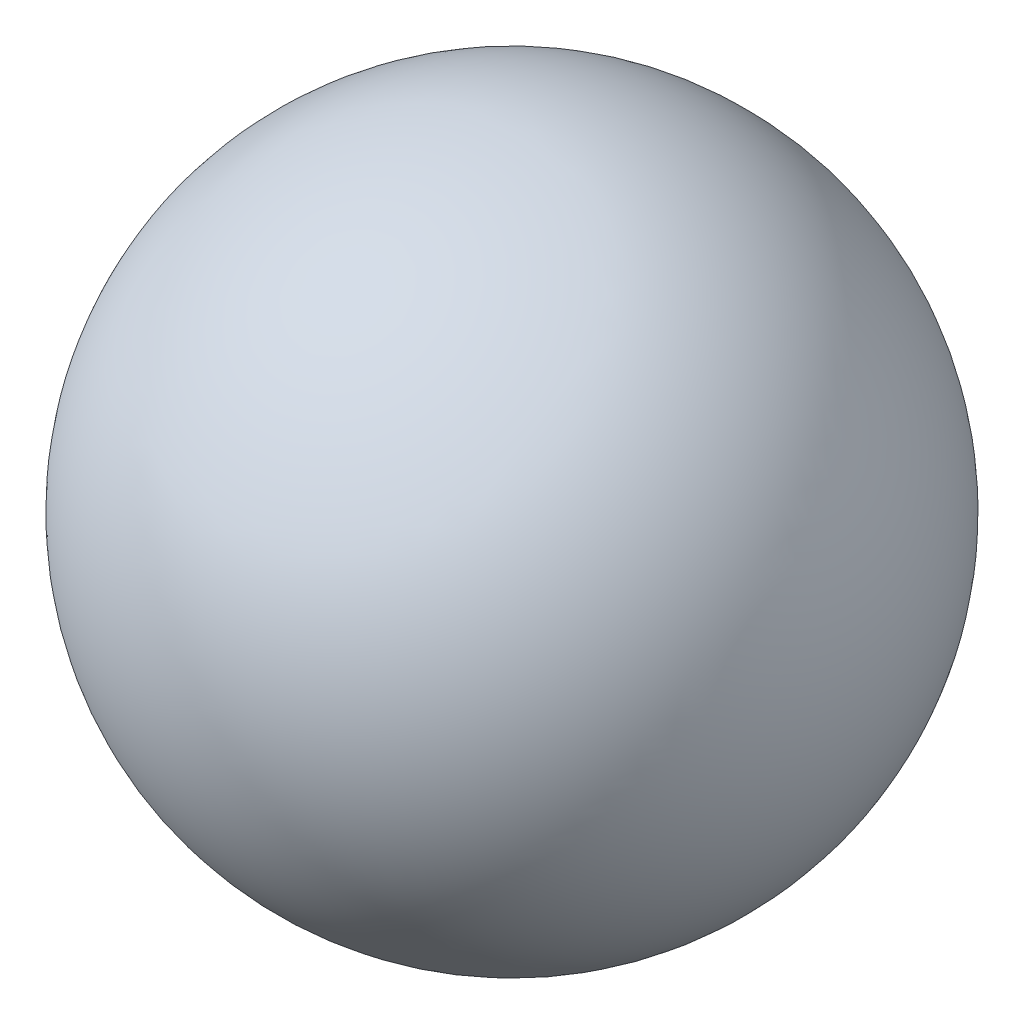
ISO-10303-21;
HEADER;
FILE_DESCRIPTION(('STEP AP214'),'2;1');
FILE_NAME('part.step','',(''),(''),'','','');
FILE_SCHEMA(('AUTOMOTIVE_DESIGN { 1 0 10303 214 1 1 1 1 }'));
ENDSEC;
DATA;
#1=APPLICATION_CONTEXT('core data for automotive mechanical design processes');
#2=APPLICATION_PROTOCOL_DEFINITION('international standard','automotive_design',2000,#1);
#3=PRODUCT_CONTEXT('',#1,'mechanical');
#4=PRODUCT('Part','Part','',(#3));
#5=PRODUCT_RELATED_PRODUCT_CATEGORY('part','',(#4));
#6=PRODUCT_DEFINITION_FORMATION('','',#4);
#7=PRODUCT_DEFINITION_CONTEXT('part definition',#1,'design');
#8=PRODUCT_DEFINITION('design','',#6,#7);
#9=PRODUCT_DEFINITION_SHAPE('','',#8);
#10=(LENGTH_UNIT() NAMED_UNIT(*) SI_UNIT(.MILLI.,.METRE.));
#11=(NAMED_UNIT(*) PLANE_ANGLE_UNIT() SI_UNIT($,.RADIAN.));
#12=(NAMED_UNIT(*) SI_UNIT($,.STERADIAN.) SOLID_ANGLE_UNIT());
#13=UNCERTAINTY_MEASURE_WITH_UNIT(LENGTH_MEASURE(1.E-05),#10,'distance_accuracy_value','');
#14=(GEOMETRIC_REPRESENTATION_CONTEXT(3) GLOBAL_UNCERTAINTY_ASSIGNED_CONTEXT((#13)) GLOBAL_UNIT_ASSIGNED_CONTEXT((#10,
#11,#12)) REPRESENTATION_CONTEXT('',''));
#15=CARTESIAN_POINT('',(0.,0.,0.));
#16=DIRECTION('',(0.,0.,1.));
#17=DIRECTION('',(1.,0.,0.));
#18=AXIS2_PLACEMENT_3D('',#15,#16,#17);
#19=CARTESIAN_POINT('',(0.,0.,0.));
#20=DIRECTION('',(-1.,0.,0.));
#21=DIRECTION('',(0.,1.,0.));
#22=AXIS2_PLACEMENT_3D('',#19,#20,#21);
#23=SPHERICAL_SURFACE('',#22,30.);
#24=CARTESIAN_POINT('',(-30.,0.,0.));
#25=VERTEX_POINT('',#24);
#26=VERTEX_LOOP('',#25);
#27=FACE_BOUND('',#26,.T.);
#28=ADVANCED_FACE('F31',(#27),#23,.T.);
#29=CLOSED_SHELL('',(#28));
#30=MANIFOLD_SOLID_BREP('B2',#29);
#31=ADVANCED_BREP_SHAPE_REPRESENTATION('',(#18,#30),#14);
#32=SHAPE_DEFINITION_REPRESENTATION(#9,#31);
ENDSEC;
END-ISO-10303-21;
